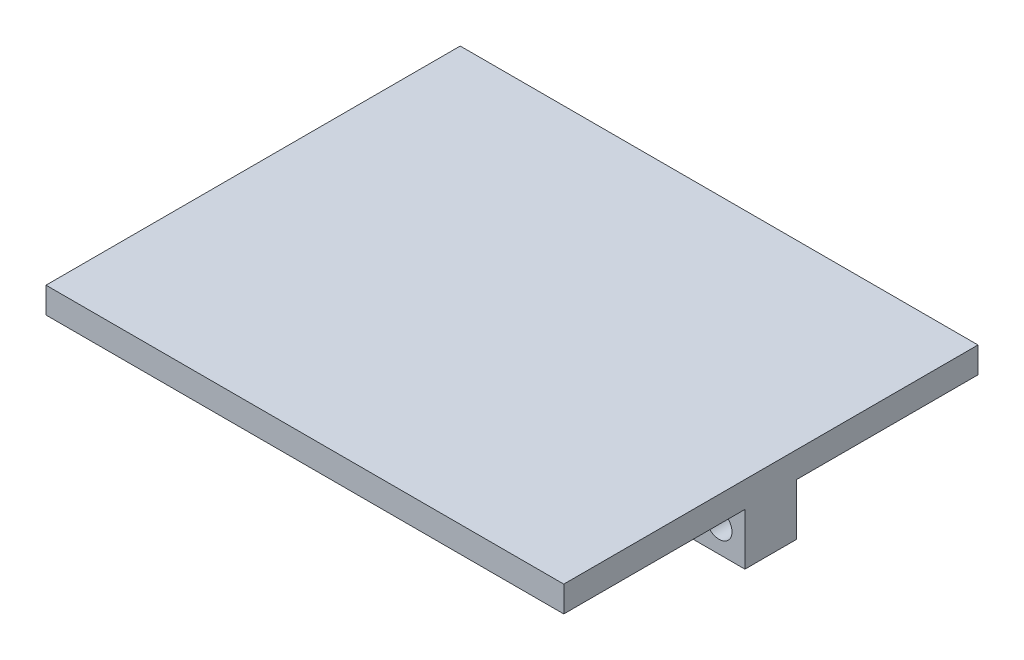
ISO-10303-21;
HEADER;
FILE_DESCRIPTION(('STEP AP214'),'2;1');
FILE_NAME('part.step','',(''),(''),'','','');
FILE_SCHEMA(('AUTOMOTIVE_DESIGN { 1 0 10303 214 1 1 1 1 }'));
ENDSEC;
DATA;
#1=APPLICATION_CONTEXT('core data for automotive mechanical design processes');
#2=APPLICATION_PROTOCOL_DEFINITION('international standard','automotive_design',2000,#1);
#3=PRODUCT_CONTEXT('',#1,'mechanical');
#4=PRODUCT('Part','Part','',(#3));
#5=PRODUCT_RELATED_PRODUCT_CATEGORY('part','',(#4));
#6=PRODUCT_DEFINITION_FORMATION('','',#4);
#7=PRODUCT_DEFINITION_CONTEXT('part definition',#1,'design');
#8=PRODUCT_DEFINITION('design','',#6,#7);
#9=PRODUCT_DEFINITION_SHAPE('','',#8);
#10=(LENGTH_UNIT() NAMED_UNIT(*) SI_UNIT(.MILLI.,.METRE.));
#11=(NAMED_UNIT(*) PLANE_ANGLE_UNIT() SI_UNIT($,.RADIAN.));
#12=(NAMED_UNIT(*) SI_UNIT($,.STERADIAN.) SOLID_ANGLE_UNIT());
#13=UNCERTAINTY_MEASURE_WITH_UNIT(LENGTH_MEASURE(1.E-05),#10,'distance_accuracy_value','');
#14=(GEOMETRIC_REPRESENTATION_CONTEXT(3) GLOBAL_UNCERTAINTY_ASSIGNED_CONTEXT((#13)) GLOBAL_UNIT_ASSIGNED_CONTEXT((#10,
#11,#12)) REPRESENTATION_CONTEXT('',''));
#15=CARTESIAN_POINT('',(0.,0.,0.));
#16=DIRECTION('',(0.,0.,1.));
#17=DIRECTION('',(1.,0.,0.));
#18=AXIS2_PLACEMENT_3D('',#15,#16,#17);
#19=CARTESIAN_POINT('',(0.,-2.5,0.));
#20=DIRECTION('',(0.,1.,0.));
#21=DIRECTION('',(0.,0.,1.));
#22=AXIS2_PLACEMENT_3D('',#19,#20,#21);
#23=PLANE('',#22);
#24=DIRECTION('',(-1.,0.,0.));
#25=VECTOR('',#24,1.);
#26=CARTESIAN_POINT('',(-40.,-2.5,5.01308972822957));
#27=LINE('',#26,#25);
#28=CARTESIAN_POINT('',(-40.,-2.5,5.01308972822957));
#29=VERTEX_POINT('',#28);
#30=CARTESIAN_POINT('',(-50.,-2.5,5.01308972822957));
#31=VERTEX_POINT('',#30);
#32=EDGE_CURVE('E59',#29,#31,#27,.T.);
#33=ORIENTED_EDGE('',*,*,#32,.F.);
#34=DIRECTION('',(0.,0.,1.));
#35=VECTOR('',#34,1.);
#36=CARTESIAN_POINT('',(-40.,-2.5,5.01308972822957));
#37=LINE('',#36,#35);
#38=CARTESIAN_POINT('',(-40.,-2.5,-4.98691027177043));
#39=VERTEX_POINT('',#38);
#40=EDGE_CURVE('E136',#39,#29,#37,.T.);
#41=ORIENTED_EDGE('',*,*,#40,.F.);
#42=DIRECTION('',(1.,0.,0.));
#43=VECTOR('',#42,1.);
#44=CARTESIAN_POINT('',(-50.,-2.5,-4.98691027177043));
#45=LINE('',#44,#43);
#46=CARTESIAN_POINT('',(-50.,-2.5,-4.98691027177043));
#47=VERTEX_POINT('',#46);
#48=EDGE_CURVE('E145',#47,#39,#45,.T.);
#49=ORIENTED_EDGE('',*,*,#48,.F.);
#50=DIRECTION('',(0.,0.,1.));
#51=VECTOR('',#50,1.);
#52=CARTESIAN_POINT('',(-50.,-2.5,-40.));
#53=LINE('',#52,#51);
#54=CARTESIAN_POINT('',(-50.,-2.5,-40.));
#55=VERTEX_POINT('',#54);
#56=EDGE_CURVE('E232',#55,#47,#53,.T.);
#57=ORIENTED_EDGE('',*,*,#56,.F.);
#58=DIRECTION('',(-1.,0.,0.));
#59=VECTOR('',#58,1.);
#60=CARTESIAN_POINT('',(-50.,-2.5,-40.));
#61=LINE('',#60,#59);
#62=CARTESIAN_POINT('',(50.,-2.5,-40.));
#63=VERTEX_POINT('',#62);
#64=EDGE_CURVE('E229',#63,#55,#61,.T.);
#65=ORIENTED_EDGE('',*,*,#64,.F.);
#66=DIRECTION('',(0.,0.,-1.));
#67=VECTOR('',#66,1.);
#68=CARTESIAN_POINT('',(50.,-2.5,-40.));
#69=LINE('',#68,#67);
#70=CARTESIAN_POINT('',(50.,-2.5,-4.98691027177043));
#71=VERTEX_POINT('',#70);
#72=EDGE_CURVE('E209',#71,#63,#69,.T.);
#73=ORIENTED_EDGE('',*,*,#72,.F.);
#74=DIRECTION('',(1.,0.,0.));
#75=VECTOR('',#74,1.);
#76=CARTESIAN_POINT('',(40.,-2.5,-4.98691027177043));
#77=LINE('',#76,#75);
#78=CARTESIAN_POINT('',(40.,-2.5,-4.98691027177043));
#79=VERTEX_POINT('',#78);
#80=EDGE_CURVE('E67',#79,#71,#77,.T.);
#81=ORIENTED_EDGE('',*,*,#80,.F.);
#82=DIRECTION('',(0.,0.,-1.));
#83=VECTOR('',#82,1.);
#84=CARTESIAN_POINT('',(40.,-2.5,5.01308972822957));
#85=LINE('',#84,#83);
#86=CARTESIAN_POINT('',(40.,-2.5,5.01308972822957));
#87=VERTEX_POINT('',#86);
#88=EDGE_CURVE('E179',#87,#79,#85,.T.);
#89=ORIENTED_EDGE('',*,*,#88,.F.);
#90=DIRECTION('',(-1.,0.,0.));
#91=VECTOR('',#90,1.);
#92=CARTESIAN_POINT('',(50.,-2.5,5.01308972822957));
#93=LINE('',#92,#91);
#94=CARTESIAN_POINT('',(50.,-2.5,5.01308972822957));
#95=VERTEX_POINT('',#94);
#96=EDGE_CURVE('E160',#95,#87,#93,.T.);
#97=ORIENTED_EDGE('',*,*,#96,.F.);
#98=CARTESIAN_POINT('',(50.,-2.5,40.));
#99=VERTEX_POINT('',#98);
#100=EDGE_CURVE('E225',#99,#95,#69,.T.);
#101=ORIENTED_EDGE('',*,*,#100,.F.);
#102=DIRECTION('',(1.,0.,0.));
#103=VECTOR('',#102,1.);
#104=CARTESIAN_POINT('',(-50.,-2.5,40.));
#105=LINE('',#104,#103);
#106=CARTESIAN_POINT('',(-50.,-2.5,40.));
#107=VERTEX_POINT('',#106);
#108=EDGE_CURVE('E215',#107,#99,#105,.T.);
#109=ORIENTED_EDGE('',*,*,#108,.F.);
#110=EDGE_CURVE('E155',#31,#107,#53,.T.);
#111=ORIENTED_EDGE('',*,*,#110,.F.);
#112=EDGE_LOOP('',(#33,#41,#49,#57,#65,#73,#81,#89,#97,#101,#109,#111));
#113=FACE_BOUND('',#112,.T.);
#114=ADVANCED_FACE('F43',(#113),#23,.F.);
#115=CARTESIAN_POINT('',(50.,2.5,-40.));
#116=DIRECTION('',(-1.,0.,0.));
#117=DIRECTION('',(0.,0.,1.));
#118=AXIS2_PLACEMENT_3D('',#115,#116,#117);
#119=PLANE('',#118);
#120=ORIENTED_EDGE('',*,*,#100,.T.);
#121=DIRECTION('',(0.,1.,0.));
#122=VECTOR('',#121,1.);
#123=CARTESIAN_POINT('',(50.,-12.5,5.01308972822957));
#124=LINE('',#123,#122);
#125=CARTESIAN_POINT('',(50.,-12.5,5.01308972822957));
#126=VERTEX_POINT('',#125);
#127=EDGE_CURVE('E201',#126,#95,#124,.T.);
#128=ORIENTED_EDGE('',*,*,#127,.F.);
#129=DIRECTION('',(0.,0.,1.));
#130=VECTOR('',#129,1.);
#131=CARTESIAN_POINT('',(50.,-12.5,5.01308972822957));
#132=LINE('',#131,#130);
#133=CARTESIAN_POINT('',(50.,-12.5,-4.98691027177043));
#134=VERTEX_POINT('',#133);
#135=EDGE_CURVE('E178',#134,#126,#132,.T.);
#136=ORIENTED_EDGE('',*,*,#135,.F.);
#137=DIRECTION('',(0.,1.,0.));
#138=VECTOR('',#137,1.);
#139=CARTESIAN_POINT('',(50.,-12.5,-4.98691027177043));
#140=LINE('',#139,#138);
#141=EDGE_CURVE('E205',#134,#71,#140,.T.);
#142=ORIENTED_EDGE('',*,*,#141,.T.);
#143=ORIENTED_EDGE('',*,*,#72,.T.);
#144=DIRECTION('',(0.,-1.,0.));
#145=VECTOR('',#144,1.);
#146=CARTESIAN_POINT('',(50.,2.5,-40.));
#147=LINE('',#146,#145);
#148=CARTESIAN_POINT('',(50.,2.5,-40.));
#149=VERTEX_POINT('',#148);
#150=EDGE_CURVE('E11',#149,#63,#147,.T.);
#151=ORIENTED_EDGE('',*,*,#150,.F.);
#152=DIRECTION('',(0.,0.,-1.));
#153=VECTOR('',#152,1.);
#154=CARTESIAN_POINT('',(50.,2.5,-40.));
#155=LINE('',#154,#153);
#156=CARTESIAN_POINT('',(50.,2.5,40.));
#157=VERTEX_POINT('',#156);
#158=EDGE_CURVE('E210',#157,#149,#155,.T.);
#159=ORIENTED_EDGE('',*,*,#158,.F.);
#160=DIRECTION('',(0.,-1.,0.));
#161=VECTOR('',#160,1.);
#162=CARTESIAN_POINT('',(50.,2.5,40.));
#163=LINE('',#162,#161);
#164=EDGE_CURVE('E224',#157,#99,#163,.T.);
#165=ORIENTED_EDGE('',*,*,#164,.T.);
#166=EDGE_LOOP('',(#120,#128,#136,#142,#143,#151,#159,#165));
#167=FACE_BOUND('',#166,.T.);
#168=ADVANCED_FACE('F45',(#167),#119,.F.);
#169=CARTESIAN_POINT('',(-50.,2.5,-40.));
#170=DIRECTION('',(0.,0.,1.));
#171=DIRECTION('',(1.,0.,0.));
#172=AXIS2_PLACEMENT_3D('',#169,#170,#171);
#173=PLANE('',#172);
#174=ORIENTED_EDGE('',*,*,#64,.T.);
#175=DIRECTION('',(0.,-1.,0.));
#176=VECTOR('',#175,1.);
#177=CARTESIAN_POINT('',(-50.,2.5,-40.));
#178=LINE('',#177,#176);
#179=CARTESIAN_POINT('',(-50.,2.5,-40.));
#180=VERTEX_POINT('',#179);
#181=EDGE_CURVE('E52',#180,#55,#178,.T.);
#182=ORIENTED_EDGE('',*,*,#181,.F.);
#183=DIRECTION('',(-1.,0.,0.));
#184=VECTOR('',#183,1.);
#185=CARTESIAN_POINT('',(-50.,2.5,-40.));
#186=LINE('',#185,#184);
#187=EDGE_CURVE('E214',#149,#180,#186,.T.);
#188=ORIENTED_EDGE('',*,*,#187,.F.);
#189=ORIENTED_EDGE('',*,*,#150,.T.);
#190=EDGE_LOOP('',(#174,#182,#188,#189));
#191=FACE_BOUND('',#190,.T.);
#192=ADVANCED_FACE('F310',(#191),#173,.F.);
#193=CARTESIAN_POINT('',(-50.,2.5,-40.));
#194=DIRECTION('',(1.,0.,0.));
#195=DIRECTION('',(0.,0.,-1.));
#196=AXIS2_PLACEMENT_3D('',#193,#194,#195);
#197=PLANE('',#196);
#198=ORIENTED_EDGE('',*,*,#56,.T.);
#199=DIRECTION('',(0.,1.,0.));
#200=VECTOR('',#199,1.);
#201=CARTESIAN_POINT('',(-50.,-12.5,-4.98691027177043));
#202=LINE('',#201,#200);
#203=CARTESIAN_POINT('',(-50.,-12.5,-4.98691027177043));
#204=VERTEX_POINT('',#203);
#205=EDGE_CURVE('E258',#204,#47,#202,.T.);
#206=ORIENTED_EDGE('',*,*,#205,.F.);
#207=DIRECTION('',(0.,0.,-1.));
#208=VECTOR('',#207,1.);
#209=CARTESIAN_POINT('',(-50.,-12.5,5.01308972822957));
#210=LINE('',#209,#208);
#211=CARTESIAN_POINT('',(-50.,-12.5,5.01308972822957));
#212=VERTEX_POINT('',#211);
#213=EDGE_CURVE('E169',#212,#204,#210,.T.);
#214=ORIENTED_EDGE('',*,*,#213,.F.);
#215=DIRECTION('',(0.,1.,0.));
#216=VECTOR('',#215,1.);
#217=CARTESIAN_POINT('',(-50.,-12.5,5.01308972822957));
#218=LINE('',#217,#216);
#219=EDGE_CURVE('E260',#212,#31,#218,.T.);
#220=ORIENTED_EDGE('',*,*,#219,.T.);
#221=ORIENTED_EDGE('',*,*,#110,.T.);
#222=DIRECTION('',(0.,-1.,0.));
#223=VECTOR('',#222,1.);
#224=CARTESIAN_POINT('',(-50.,2.5,40.));
#225=LINE('',#224,#223);
#226=CARTESIAN_POINT('',(-50.,2.5,40.));
#227=VERTEX_POINT('',#226);
#228=EDGE_CURVE('E241',#227,#107,#225,.T.);
#229=ORIENTED_EDGE('',*,*,#228,.F.);
#230=DIRECTION('',(0.,0.,1.));
#231=VECTOR('',#230,1.);
#232=CARTESIAN_POINT('',(-50.,2.5,-40.));
#233=LINE('',#232,#231);
#234=EDGE_CURVE('E218',#180,#227,#233,.T.);
#235=ORIENTED_EDGE('',*,*,#234,.F.);
#236=ORIENTED_EDGE('',*,*,#181,.T.);
#237=EDGE_LOOP('',(#198,#206,#214,#220,#221,#229,#235,#236));
#238=FACE_BOUND('',#237,.T.);
#239=ADVANCED_FACE('F250',(#238),#197,.F.);
#240=CARTESIAN_POINT('',(-50.,2.5,40.));
#241=DIRECTION('',(0.,0.,-1.));
#242=DIRECTION('',(-1.,0.,0.));
#243=AXIS2_PLACEMENT_3D('',#240,#241,#242);
#244=PLANE('',#243);
#245=ORIENTED_EDGE('',*,*,#108,.T.);
#246=ORIENTED_EDGE('',*,*,#164,.F.);
#247=DIRECTION('',(1.,0.,0.));
#248=VECTOR('',#247,1.);
#249=CARTESIAN_POINT('',(-50.,2.5,40.));
#250=LINE('',#249,#248);
#251=EDGE_CURVE('E221',#227,#157,#250,.T.);
#252=ORIENTED_EDGE('',*,*,#251,.F.);
#253=ORIENTED_EDGE('',*,*,#228,.T.);
#254=EDGE_LOOP('',(#245,#246,#252,#253));
#255=FACE_BOUND('',#254,.T.);
#256=ADVANCED_FACE('F316',(#255),#244,.F.);
#257=CARTESIAN_POINT('',(0.,2.5,0.));
#258=DIRECTION('',(0.,1.,0.));
#259=DIRECTION('',(0.,0.,1.));
#260=AXIS2_PLACEMENT_3D('',#257,#258,#259);
#261=PLANE('',#260);
#262=ORIENTED_EDGE('',*,*,#158,.T.);
#263=ORIENTED_EDGE('',*,*,#187,.T.);
#264=ORIENTED_EDGE('',*,*,#234,.T.);
#265=ORIENTED_EDGE('',*,*,#251,.T.);
#266=EDGE_LOOP('',(#262,#263,#264,#265));
#267=FACE_BOUND('',#266,.T.);
#268=ADVANCED_FACE('F314',(#267),#261,.T.);
#269=CARTESIAN_POINT('',(40.,-12.5,-4.98691027177043));
#270=DIRECTION('',(0.,0.,1.));
#271=DIRECTION('',(1.,0.,0.));
#272=AXIS2_PLACEMENT_3D('',#269,#270,#271);
#273=PLANE('',#272);
#274=CARTESIAN_POINT('',(45.,-7.5,-4.98691027177043));
#275=DIRECTION('',(0.,0.,1.));
#276=DIRECTION('',(1.,0.,0.));
#277=AXIS2_PLACEMENT_3D('',#274,#275,#276);
#278=CIRCLE('',#277,2.5);
#279=CARTESIAN_POINT('',(47.5,-7.5,-4.98691027177043));
#280=VERTEX_POINT('',#279);
#281=EDGE_CURVE('E268',#280,#280,#278,.T.);
#282=ORIENTED_EDGE('',*,*,#281,.T.);
#283=EDGE_LOOP('',(#282));
#284=FACE_BOUND('',#283,.T.);
#285=ORIENTED_EDGE('',*,*,#80,.T.);
#286=ORIENTED_EDGE('',*,*,#141,.F.);
#287=DIRECTION('',(1.,0.,0.));
#288=VECTOR('',#287,1.);
#289=CARTESIAN_POINT('',(40.,-12.5,-4.98691027177043));
#290=LINE('',#289,#288);
#291=CARTESIAN_POINT('',(40.,-12.5,-4.98691027177043));
#292=VERTEX_POINT('',#291);
#293=EDGE_CURVE('E174',#292,#134,#290,.T.);
#294=ORIENTED_EDGE('',*,*,#293,.F.);
#295=DIRECTION('',(0.,1.,0.));
#296=VECTOR('',#295,1.);
#297=CARTESIAN_POINT('',(40.,-12.5,-4.98691027177043));
#298=LINE('',#297,#296);
#299=EDGE_CURVE('E187',#292,#79,#298,.T.);
#300=ORIENTED_EDGE('',*,*,#299,.T.);
#301=EDGE_LOOP('',(#285,#286,#294,#300));
#302=FACE_BOUND('',#301,.T.);
#303=ADVANCED_FACE('F341',(#284,#302),#273,.F.);
#304=CARTESIAN_POINT('',(50.,-12.5,5.01308972822957));
#305=DIRECTION('',(0.,0.,-1.));
#306=DIRECTION('',(-1.,0.,0.));
#307=AXIS2_PLACEMENT_3D('',#304,#305,#306);
#308=PLANE('',#307);
#309=CARTESIAN_POINT('',(45.,-7.5,5.01308972822958));
#310=DIRECTION('',(0.,0.,1.));
#311=DIRECTION('',(1.,0.,0.));
#312=AXIS2_PLACEMENT_3D('',#309,#310,#311);
#313=CIRCLE('',#312,2.5);
#314=CARTESIAN_POINT('',(47.5,-7.5,5.01308972822958));
#315=VERTEX_POINT('',#314);
#316=EDGE_CURVE('E272',#315,#315,#313,.T.);
#317=ORIENTED_EDGE('',*,*,#316,.F.);
#318=EDGE_LOOP('',(#317));
#319=FACE_BOUND('',#318,.T.);
#320=ORIENTED_EDGE('',*,*,#96,.T.);
#321=DIRECTION('',(0.,1.,0.));
#322=VECTOR('',#321,1.);
#323=CARTESIAN_POINT('',(40.,-12.5,5.01308972822957));
#324=LINE('',#323,#322);
#325=CARTESIAN_POINT('',(40.,-12.5,5.01308972822957));
#326=VERTEX_POINT('',#325);
#327=EDGE_CURVE('E197',#326,#87,#324,.T.);
#328=ORIENTED_EDGE('',*,*,#327,.F.);
#329=DIRECTION('',(-1.,0.,0.));
#330=VECTOR('',#329,1.);
#331=CARTESIAN_POINT('',(50.,-12.5,5.01308972822957));
#332=LINE('',#331,#330);
#333=EDGE_CURVE('E182',#126,#326,#332,.T.);
#334=ORIENTED_EDGE('',*,*,#333,.F.);
#335=ORIENTED_EDGE('',*,*,#127,.T.);
#336=EDGE_LOOP('',(#320,#328,#334,#335));
#337=FACE_BOUND('',#336,.T.);
#338=ADVANCED_FACE('F335',(#319,#337),#308,.F.);
#339=CARTESIAN_POINT('',(40.,-12.5,5.01308972822957));
#340=DIRECTION('',(1.,0.,0.));
#341=DIRECTION('',(0.,0.,-1.));
#342=AXIS2_PLACEMENT_3D('',#339,#340,#341);
#343=PLANE('',#342);
#344=ORIENTED_EDGE('',*,*,#88,.T.);
#345=ORIENTED_EDGE('',*,*,#299,.F.);
#346=DIRECTION('',(0.,0.,-1.));
#347=VECTOR('',#346,1.);
#348=CARTESIAN_POINT('',(40.,-12.5,5.01308972822957));
#349=LINE('',#348,#347);
#350=EDGE_CURVE('E185',#326,#292,#349,.T.);
#351=ORIENTED_EDGE('',*,*,#350,.F.);
#352=ORIENTED_EDGE('',*,*,#327,.T.);
#353=EDGE_LOOP('',(#344,#345,#351,#352));
#354=FACE_BOUND('',#353,.T.);
#355=ADVANCED_FACE('F301',(#354),#343,.F.);
#356=CARTESIAN_POINT('',(0.,-12.5,0.));
#357=DIRECTION('',(0.,1.,0.));
#358=DIRECTION('',(0.,0.,1.));
#359=AXIS2_PLACEMENT_3D('',#356,#357,#358);
#360=PLANE('',#359);
#361=ORIENTED_EDGE('',*,*,#293,.T.);
#362=ORIENTED_EDGE('',*,*,#135,.T.);
#363=ORIENTED_EDGE('',*,*,#333,.T.);
#364=ORIENTED_EDGE('',*,*,#350,.T.);
#365=EDGE_LOOP('',(#361,#362,#363,#364));
#366=FACE_BOUND('',#365,.T.);
#367=ADVANCED_FACE('F294',(#366),#360,.F.);
#368=CARTESIAN_POINT('',(-40.,-12.5,5.01308972822957));
#369=DIRECTION('',(0.,0.,-1.));
#370=DIRECTION('',(-1.,0.,0.));
#371=AXIS2_PLACEMENT_3D('',#368,#369,#370);
#372=PLANE('',#371);
#373=CARTESIAN_POINT('',(-45.,-7.5,5.01308972822958));
#374=DIRECTION('',(0.,0.,1.));
#375=DIRECTION('',(1.,0.,0.));
#376=AXIS2_PLACEMENT_3D('',#373,#374,#375);
#377=CIRCLE('',#376,2.5);
#378=CARTESIAN_POINT('',(-42.5,-7.5,5.01308972822958));
#379=VERTEX_POINT('',#378);
#380=EDGE_CURVE('E276',#379,#379,#377,.T.);
#381=ORIENTED_EDGE('',*,*,#380,.F.);
#382=EDGE_LOOP('',(#381));
#383=FACE_BOUND('',#382,.T.);
#384=ORIENTED_EDGE('',*,*,#32,.T.);
#385=ORIENTED_EDGE('',*,*,#219,.F.);
#386=DIRECTION('',(-1.,0.,0.));
#387=VECTOR('',#386,1.);
#388=CARTESIAN_POINT('',(-40.,-12.5,5.01308972822957));
#389=LINE('',#388,#387);
#390=CARTESIAN_POINT('',(-40.,-12.5,5.01308972822957));
#391=VERTEX_POINT('',#390);
#392=EDGE_CURVE('E146',#391,#212,#389,.T.);
#393=ORIENTED_EDGE('',*,*,#392,.F.);
#394=DIRECTION('',(0.,1.,0.));
#395=VECTOR('',#394,1.);
#396=CARTESIAN_POINT('',(-40.,-12.5,5.01308972822957));
#397=LINE('',#396,#395);
#398=EDGE_CURVE('E139',#391,#29,#397,.T.);
#399=ORIENTED_EDGE('',*,*,#398,.T.);
#400=EDGE_LOOP('',(#384,#385,#393,#399));
#401=FACE_BOUND('',#400,.T.);
#402=ADVANCED_FACE('F148',(#383,#401),#372,.F.);
#403=CARTESIAN_POINT('',(-50.,-12.5,-4.98691027177043));
#404=DIRECTION('',(0.,0.,1.));
#405=DIRECTION('',(1.,0.,0.));
#406=AXIS2_PLACEMENT_3D('',#403,#404,#405);
#407=PLANE('',#406);
#408=CARTESIAN_POINT('',(-45.,-7.5,-4.98691027177043));
#409=DIRECTION('',(0.,0.,1.));
#410=DIRECTION('',(1.,0.,0.));
#411=AXIS2_PLACEMENT_3D('',#408,#409,#410);
#412=CIRCLE('',#411,2.5);
#413=CARTESIAN_POINT('',(-42.5,-7.5,-4.98691027177043));
#414=VERTEX_POINT('',#413);
#415=EDGE_CURVE('E265',#414,#414,#412,.T.);
#416=ORIENTED_EDGE('',*,*,#415,.T.);
#417=EDGE_LOOP('',(#416));
#418=FACE_BOUND('',#417,.T.);
#419=ORIENTED_EDGE('',*,*,#48,.T.);
#420=DIRECTION('',(0.,1.,0.));
#421=VECTOR('',#420,1.);
#422=CARTESIAN_POINT('',(-40.,-12.5,-4.98691027177043));
#423=LINE('',#422,#421);
#424=CARTESIAN_POINT('',(-40.,-12.5,-4.98691027177043));
#425=VERTEX_POINT('',#424);
#426=EDGE_CURVE('E142',#425,#39,#423,.T.);
#427=ORIENTED_EDGE('',*,*,#426,.F.);
#428=DIRECTION('',(1.,0.,0.));
#429=VECTOR('',#428,1.);
#430=CARTESIAN_POINT('',(-50.,-12.5,-4.98691027177043));
#431=LINE('',#430,#429);
#432=EDGE_CURVE('E166',#204,#425,#431,.T.);
#433=ORIENTED_EDGE('',*,*,#432,.F.);
#434=ORIENTED_EDGE('',*,*,#205,.T.);
#435=EDGE_LOOP('',(#419,#427,#433,#434));
#436=FACE_BOUND('',#435,.T.);
#437=ADVANCED_FACE('F256',(#418,#436),#407,.F.);
#438=CARTESIAN_POINT('',(-40.,-12.5,5.01308972822957));
#439=DIRECTION('',(-1.,0.,0.));
#440=DIRECTION('',(0.,0.,1.));
#441=AXIS2_PLACEMENT_3D('',#438,#439,#440);
#442=PLANE('',#441);
#443=ORIENTED_EDGE('',*,*,#40,.T.);
#444=ORIENTED_EDGE('',*,*,#398,.F.);
#445=DIRECTION('',(0.,0.,1.));
#446=VECTOR('',#445,1.);
#447=CARTESIAN_POINT('',(-40.,-12.5,5.01308972822957));
#448=LINE('',#447,#446);
#449=EDGE_CURVE('E151',#425,#391,#448,.T.);
#450=ORIENTED_EDGE('',*,*,#449,.F.);
#451=ORIENTED_EDGE('',*,*,#426,.T.);
#452=EDGE_LOOP('',(#443,#444,#450,#451));
#453=FACE_BOUND('',#452,.T.);
#454=ADVANCED_FACE('F137',(#453),#442,.F.);
#455=CARTESIAN_POINT('',(0.,-12.5,0.));
#456=DIRECTION('',(0.,-1.,0.));
#457=DIRECTION('',(0.,0.,-1.));
#458=AXIS2_PLACEMENT_3D('',#455,#456,#457);
#459=PLANE('',#458);
#460=ORIENTED_EDGE('',*,*,#392,.T.);
#461=ORIENTED_EDGE('',*,*,#213,.T.);
#462=ORIENTED_EDGE('',*,*,#432,.T.);
#463=ORIENTED_EDGE('',*,*,#449,.T.);
#464=EDGE_LOOP('',(#460,#461,#462,#463));
#465=FACE_BOUND('',#464,.T.);
#466=ADVANCED_FACE('F289',(#465),#459,.T.);
#467=CARTESIAN_POINT('',(-45.,-7.5,-4.98691027177043));
#468=DIRECTION('',(0.,0.,1.));
#469=DIRECTION('',(1.,0.,0.));
#470=AXIS2_PLACEMENT_3D('',#467,#468,#469);
#471=CYLINDRICAL_SURFACE('',#470,2.5);
#472=ORIENTED_EDGE('',*,*,#415,.F.);
#473=EDGE_LOOP('',(#472));
#474=FACE_BOUND('',#473,.T.);
#475=ORIENTED_EDGE('',*,*,#380,.T.);
#476=EDGE_LOOP('',(#475));
#477=FACE_BOUND('',#476,.T.);
#478=ADVANCED_FACE('F285',(#474,#477),#471,.F.);
#479=CARTESIAN_POINT('',(45.,-7.5,-4.98691027177043));
#480=DIRECTION('',(0.,0.,1.));
#481=DIRECTION('',(1.,0.,0.));
#482=AXIS2_PLACEMENT_3D('',#479,#480,#481);
#483=CYLINDRICAL_SURFACE('',#482,2.5);
#484=ORIENTED_EDGE('',*,*,#281,.F.);
#485=EDGE_LOOP('',(#484));
#486=FACE_BOUND('',#485,.T.);
#487=ORIENTED_EDGE('',*,*,#316,.T.);
#488=EDGE_LOOP('',(#487));
#489=FACE_BOUND('',#488,.T.);
#490=ADVANCED_FACE('F288',(#486,#489),#483,.F.);
#491=CLOSED_SHELL('',(#114,#168,#192,#239,#256,#268,#303,#338,#355,#367,#402,#437,#454,#466,
#478,#490));
#492=MANIFOLD_SOLID_BREP('B2',#491);
#493=ADVANCED_BREP_SHAPE_REPRESENTATION('',(#18,#492),#14);
#494=SHAPE_DEFINITION_REPRESENTATION(#9,#493);
ENDSEC;
END-ISO-10303-21;
